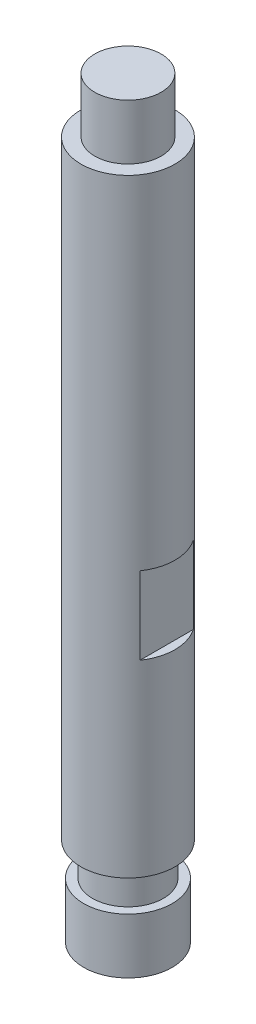
ISO-10303-21;
HEADER;
FILE_DESCRIPTION(('STEP AP214'),'2;1');
FILE_NAME('part.step','',(''),(''),'','','');
FILE_SCHEMA(('AUTOMOTIVE_DESIGN { 1 0 10303 214 1 1 1 1 }'));
ENDSEC;
DATA;
#1=APPLICATION_CONTEXT('core data for automotive mechanical design processes');
#2=APPLICATION_PROTOCOL_DEFINITION('international standard','automotive_design',2000,#1);
#3=PRODUCT_CONTEXT('',#1,'mechanical');
#4=PRODUCT('Part','Part','',(#3));
#5=PRODUCT_RELATED_PRODUCT_CATEGORY('part','',(#4));
#6=PRODUCT_DEFINITION_FORMATION('','',#4);
#7=PRODUCT_DEFINITION_CONTEXT('part definition',#1,'design');
#8=PRODUCT_DEFINITION('design','',#6,#7);
#9=PRODUCT_DEFINITION_SHAPE('','',#8);
#10=(LENGTH_UNIT() NAMED_UNIT(*) SI_UNIT(.MILLI.,.METRE.));
#11=(NAMED_UNIT(*) PLANE_ANGLE_UNIT() SI_UNIT($,.RADIAN.));
#12=(NAMED_UNIT(*) SI_UNIT($,.STERADIAN.) SOLID_ANGLE_UNIT());
#13=UNCERTAINTY_MEASURE_WITH_UNIT(LENGTH_MEASURE(1.E-05),#10,'distance_accuracy_value','');
#14=(GEOMETRIC_REPRESENTATION_CONTEXT(3) GLOBAL_UNCERTAINTY_ASSIGNED_CONTEXT((#13)) GLOBAL_UNIT_ASSIGNED_CONTEXT((#10,
#11,#12)) REPRESENTATION_CONTEXT('',''));
#15=CARTESIAN_POINT('',(0.,0.,0.));
#16=DIRECTION('',(0.,0.,1.));
#17=DIRECTION('',(1.,0.,0.));
#18=AXIS2_PLACEMENT_3D('',#15,#16,#17);
#19=CARTESIAN_POINT('',(0.,55.,0.));
#20=DIRECTION('',(0.,-1.,0.));
#21=DIRECTION('',(0.,0.,-1.));
#22=AXIS2_PLACEMENT_3D('',#19,#20,#21);
#23=CYLINDRICAL_SURFACE('',#22,4.25);
#24=CARTESIAN_POINT('',(0.,0.,0.));
#25=DIRECTION('',(0.,1.,0.));
#26=DIRECTION('',(0.,0.,1.));
#27=AXIS2_PLACEMENT_3D('',#24,#25,#26);
#28=CIRCLE('',#27,4.25);
#29=CARTESIAN_POINT('',(0.,0.,4.25));
#30=VERTEX_POINT('',#29);
#31=EDGE_CURVE('E132',#30,#30,#28,.T.);
#32=ORIENTED_EDGE('',*,*,#31,.T.);
#33=EDGE_LOOP('',(#32));
#34=FACE_BOUND('',#33,.T.);
#35=CARTESIAN_POINT('',(0.,55.,0.));
#36=DIRECTION('',(0.,1.,0.));
#37=DIRECTION('',(0.,0.,1.));
#38=AXIS2_PLACEMENT_3D('',#35,#36,#37);
#39=CIRCLE('',#38,4.25);
#40=CARTESIAN_POINT('',(0.,55.,4.25));
#41=VERTEX_POINT('',#40);
#42=EDGE_CURVE('E127',#41,#41,#39,.T.);
#43=ORIENTED_EDGE('',*,*,#42,.F.);
#44=EDGE_LOOP('',(#43));
#45=FACE_BOUND('',#44,.T.);
#46=CARTESIAN_POINT('',(0.,17.,0.));
#47=DIRECTION('',(0.,1.,0.));
#48=DIRECTION('',(0.,0.,1.));
#49=AXIS2_PLACEMENT_3D('',#46,#47,#48);
#50=CIRCLE('',#49,4.25);
#51=CARTESIAN_POINT('',(3.5,17.,2.41091269024824));
#52=VERTEX_POINT('',#51);
#53=CARTESIAN_POINT('',(3.5,17.,-2.41091269024824));
#54=VERTEX_POINT('',#53);
#55=EDGE_CURVE('E104',#52,#54,#50,.T.);
#56=ORIENTED_EDGE('',*,*,#55,.F.);
#57=DIRECTION('',(0.,-1.,0.));
#58=VECTOR('',#57,1.);
#59=CARTESIAN_POINT('',(3.5,55.,2.41091269024824));
#60=LINE('',#59,#58);
#61=CARTESIAN_POINT('',(3.5,24.,2.41091269024824));
#62=VERTEX_POINT('',#61);
#63=EDGE_CURVE('E98',#62,#52,#60,.T.);
#64=ORIENTED_EDGE('',*,*,#63,.F.);
#65=CARTESIAN_POINT('',(0.,24.,0.));
#66=DIRECTION('',(0.,-1.,0.));
#67=DIRECTION('',(0.,0.,-1.));
#68=AXIS2_PLACEMENT_3D('',#65,#66,#67);
#69=CIRCLE('',#68,4.25);
#70=CARTESIAN_POINT('',(3.5,24.,-2.41091269024824));
#71=VERTEX_POINT('',#70);
#72=EDGE_CURVE('E82',#71,#62,#69,.T.);
#73=ORIENTED_EDGE('',*,*,#72,.F.);
#74=DIRECTION('',(0.,-1.,0.));
#75=VECTOR('',#74,1.);
#76=CARTESIAN_POINT('',(3.5,55.,-2.41091269024824));
#77=LINE('',#76,#75);
#78=EDGE_CURVE('E91',#54,#71,#77,.F.);
#79=ORIENTED_EDGE('',*,*,#78,.F.);
#80=EDGE_LOOP('',(#56,#64,#73,#79));
#81=FACE_BOUND('',#80,.T.);
#82=CARTESIAN_POINT('',(0.,24.,0.));
#83=DIRECTION('',(0.,-1.,0.));
#84=DIRECTION('',(0.,0.,-1.));
#85=AXIS2_PLACEMENT_3D('',#82,#83,#84);
#86=CIRCLE('',#85,4.25);
#87=CARTESIAN_POINT('',(-3.5,24.,2.41091269024824));
#88=VERTEX_POINT('',#87);
#89=CARTESIAN_POINT('',(-3.5,24.,-2.41091269024824));
#90=VERTEX_POINT('',#89);
#91=EDGE_CURVE('E111',#88,#90,#86,.T.);
#92=ORIENTED_EDGE('',*,*,#91,.F.);
#93=DIRECTION('',(0.,-1.,0.));
#94=VECTOR('',#93,1.);
#95=CARTESIAN_POINT('',(-3.50000000000001,55.,2.41091269024823));
#96=LINE('',#95,#94);
#97=CARTESIAN_POINT('',(-3.5,17.,2.41091269024823));
#98=VERTEX_POINT('',#97);
#99=EDGE_CURVE('E11',#98,#88,#96,.F.);
#100=ORIENTED_EDGE('',*,*,#99,.F.);
#101=CARTESIAN_POINT('',(0.,17.,0.));
#102=DIRECTION('',(0.,1.,0.));
#103=DIRECTION('',(0.,0.,1.));
#104=AXIS2_PLACEMENT_3D('',#101,#102,#103);
#105=CIRCLE('',#104,4.25);
#106=CARTESIAN_POINT('',(-3.5,17.,-2.41091269024823));
#107=VERTEX_POINT('',#106);
#108=EDGE_CURVE('E51',#107,#98,#105,.T.);
#109=ORIENTED_EDGE('',*,*,#108,.F.);
#110=DIRECTION('',(0.,-1.,0.));
#111=VECTOR('',#110,1.);
#112=CARTESIAN_POINT('',(-3.50000000000001,55.,-2.41091269024823));
#113=LINE('',#112,#111);
#114=EDGE_CURVE('E117',#90,#107,#113,.T.);
#115=ORIENTED_EDGE('',*,*,#114,.F.);
#116=EDGE_LOOP('',(#92,#100,#109,#115));
#117=FACE_BOUND('',#116,.T.);
#118=ADVANCED_FACE('F43',(#34,#45,#81,#117),#23,.T.);
#119=CARTESIAN_POINT('',(0.,55.,0.));
#120=DIRECTION('',(0.,1.,0.));
#121=DIRECTION('',(0.,0.,1.));
#122=AXIS2_PLACEMENT_3D('',#119,#120,#121);
#123=PLANE('',#122);
#124=CARTESIAN_POINT('',(0.,55.,0.));
#125=DIRECTION('',(0.,1.,0.));
#126=DIRECTION('',(0.,0.,1.));
#127=AXIS2_PLACEMENT_3D('',#124,#125,#126);
#128=CIRCLE('',#127,3.);
#129=CARTESIAN_POINT('',(0.,55.,3.));
#130=VERTEX_POINT('',#129);
#131=EDGE_CURVE('E92',#130,#130,#128,.T.);
#132=ORIENTED_EDGE('',*,*,#131,.F.);
#133=EDGE_LOOP('',(#132));
#134=FACE_BOUND('',#133,.T.);
#135=ORIENTED_EDGE('',*,*,#42,.T.);
#136=EDGE_LOOP('',(#135));
#137=FACE_BOUND('',#136,.T.);
#138=ADVANCED_FACE('F188',(#134,#137),#123,.T.);
#139=CARTESIAN_POINT('',(0.,0.,0.));
#140=DIRECTION('',(0.,1.,0.));
#141=DIRECTION('',(0.,0.,1.));
#142=AXIS2_PLACEMENT_3D('',#139,#140,#141);
#143=PLANE('',#142);
#144=ORIENTED_EDGE('',*,*,#31,.F.);
#145=EDGE_LOOP('',(#144));
#146=FACE_BOUND('',#145,.T.);
#147=CARTESIAN_POINT('',(0.,0.,0.));
#148=DIRECTION('',(0.,1.,0.));
#149=DIRECTION('',(0.,0.,1.));
#150=AXIS2_PLACEMENT_3D('',#147,#148,#149);
#151=CIRCLE('',#150,3.2);
#152=CARTESIAN_POINT('',(0.,0.,3.2));
#153=VERTEX_POINT('',#152);
#154=EDGE_CURVE('E157',#153,#153,#151,.T.);
#155=ORIENTED_EDGE('',*,*,#154,.T.);
#156=EDGE_LOOP('',(#155));
#157=FACE_BOUND('',#156,.T.);
#158=ADVANCED_FACE('F193',(#146,#157),#143,.F.);
#159=CARTESIAN_POINT('',(0.,60.,0.));
#160=DIRECTION('',(0.,-1.,0.));
#161=DIRECTION('',(0.,0.,-1.));
#162=AXIS2_PLACEMENT_3D('',#159,#160,#161);
#163=CYLINDRICAL_SURFACE('',#162,3.);
#164=CARTESIAN_POINT('',(0.,60.,0.));
#165=DIRECTION('',(0.,1.,0.));
#166=DIRECTION('',(0.,0.,1.));
#167=AXIS2_PLACEMENT_3D('',#164,#165,#166);
#168=CIRCLE('',#167,3.);
#169=CARTESIAN_POINT('',(0.,60.,3.));
#170=VERTEX_POINT('',#169);
#171=EDGE_CURVE('E137',#170,#170,#168,.T.);
#172=ORIENTED_EDGE('',*,*,#171,.F.);
#173=EDGE_LOOP('',(#172));
#174=FACE_BOUND('',#173,.T.);
#175=ORIENTED_EDGE('',*,*,#131,.T.);
#176=EDGE_LOOP('',(#175));
#177=FACE_BOUND('',#176,.T.);
#178=ADVANCED_FACE('F202',(#174,#177),#163,.T.);
#179=CARTESIAN_POINT('',(0.,60.,0.));
#180=DIRECTION('',(0.,1.,0.));
#181=DIRECTION('',(0.,0.,1.));
#182=AXIS2_PLACEMENT_3D('',#179,#180,#181);
#183=PLANE('',#182);
#184=ORIENTED_EDGE('',*,*,#171,.T.);
#185=EDGE_LOOP('',(#184));
#186=FACE_BOUND('',#185,.T.);
#187=ADVANCED_FACE('F185',(#186),#183,.T.);
#188=CARTESIAN_POINT('',(3.5,24.,10.));
#189=DIRECTION('',(1.,0.,0.));
#190=DIRECTION('',(0.,1.,0.));
#191=AXIS2_PLACEMENT_3D('',#188,#189,#190);
#192=PLANE('',#191);
#193=ORIENTED_EDGE('',*,*,#63,.T.);
#194=DIRECTION('',(0.,0.,-1.));
#195=VECTOR('',#194,1.);
#196=CARTESIAN_POINT('',(3.5,17.,10.));
#197=LINE('',#196,#195);
#198=EDGE_CURVE('E101',#52,#54,#197,.T.);
#199=ORIENTED_EDGE('',*,*,#198,.T.);
#200=ORIENTED_EDGE('',*,*,#78,.T.);
#201=DIRECTION('',(0.,0.,-1.));
#202=VECTOR('',#201,1.);
#203=CARTESIAN_POINT('',(3.5,24.,10.));
#204=LINE('',#203,#202);
#205=EDGE_CURVE('E85',#62,#71,#204,.T.);
#206=ORIENTED_EDGE('',*,*,#205,.F.);
#207=EDGE_LOOP('',(#193,#199,#200,#206));
#208=FACE_BOUND('',#207,.T.);
#209=ADVANCED_FACE('F96',(#208),#192,.T.);
#210=CARTESIAN_POINT('',(3.5,17.,10.));
#211=DIRECTION('',(0.,1.,0.));
#212=DIRECTION('',(0.,0.,1.));
#213=AXIS2_PLACEMENT_3D('',#210,#211,#212);
#214=PLANE('',#213);
#215=ORIENTED_EDGE('',*,*,#198,.F.);
#216=ORIENTED_EDGE('',*,*,#55,.T.);
#217=EDGE_LOOP('',(#215,#216));
#218=FACE_BOUND('',#217,.T.);
#219=ADVANCED_FACE('F176',(#218),#214,.T.);
#220=CARTESIAN_POINT('',(3.5,24.,10.));
#221=DIRECTION('',(0.,-1.,0.));
#222=DIRECTION('',(0.,0.,-1.));
#223=AXIS2_PLACEMENT_3D('',#220,#221,#222);
#224=PLANE('',#223);
#225=ORIENTED_EDGE('',*,*,#205,.T.);
#226=ORIENTED_EDGE('',*,*,#72,.T.);
#227=EDGE_LOOP('',(#225,#226));
#228=FACE_BOUND('',#227,.T.);
#229=ADVANCED_FACE('F84',(#228),#224,.T.);
#230=CARTESIAN_POINT('',(-3.5,17.,10.));
#231=DIRECTION('',(0.,1.,0.));
#232=DIRECTION('',(0.,0.,1.));
#233=AXIS2_PLACEMENT_3D('',#230,#231,#232);
#234=PLANE('',#233);
#235=DIRECTION('',(0.,0.,-1.));
#236=VECTOR('',#235,1.);
#237=CARTESIAN_POINT('',(-3.5,17.,10.));
#238=LINE('',#237,#236);
#239=EDGE_CURVE('E142',#98,#107,#238,.T.);
#240=ORIENTED_EDGE('',*,*,#239,.T.);
#241=ORIENTED_EDGE('',*,*,#108,.T.);
#242=EDGE_LOOP('',(#240,#241));
#243=FACE_BOUND('',#242,.T.);
#244=ADVANCED_FACE('F183',(#243),#234,.T.);
#245=CARTESIAN_POINT('',(-3.5,24.,10.));
#246=DIRECTION('',(-1.,0.,0.));
#247=DIRECTION('',(0.,-1.,0.));
#248=AXIS2_PLACEMENT_3D('',#245,#246,#247);
#249=PLANE('',#248);
#250=ORIENTED_EDGE('',*,*,#114,.T.);
#251=ORIENTED_EDGE('',*,*,#239,.F.);
#252=ORIENTED_EDGE('',*,*,#99,.T.);
#253=DIRECTION('',(0.,0.,-1.));
#254=VECTOR('',#253,1.);
#255=CARTESIAN_POINT('',(-3.5,24.,10.));
#256=LINE('',#255,#254);
#257=EDGE_CURVE('E167',#88,#90,#256,.T.);
#258=ORIENTED_EDGE('',*,*,#257,.T.);
#259=EDGE_LOOP('',(#250,#251,#252,#258));
#260=FACE_BOUND('',#259,.T.);
#261=ADVANCED_FACE('F235',(#260),#249,.T.);
#262=CARTESIAN_POINT('',(-3.5,24.,10.));
#263=DIRECTION('',(0.,-1.,0.));
#264=DIRECTION('',(0.,0.,-1.));
#265=AXIS2_PLACEMENT_3D('',#262,#263,#264);
#266=PLANE('',#265);
#267=ORIENTED_EDGE('',*,*,#257,.F.);
#268=ORIENTED_EDGE('',*,*,#91,.T.);
#269=EDGE_LOOP('',(#267,#268));
#270=FACE_BOUND('',#269,.T.);
#271=ADVANCED_FACE('F239',(#270),#266,.T.);
#272=CARTESIAN_POINT('',(0.,-3.,-4.));
#273=DIRECTION('',(0.,1.,0.));
#274=DIRECTION('',(0.,0.,1.));
#275=AXIS2_PLACEMENT_3D('',#272,#273,#274);
#276=PLANE('',#275);
#277=CARTESIAN_POINT('',(0.,-3.,0.));
#278=DIRECTION('',(0.,1.,0.));
#279=DIRECTION('',(0.,0.,1.));
#280=AXIS2_PLACEMENT_3D('',#277,#278,#279);
#281=CIRCLE('',#280,4.);
#282=CARTESIAN_POINT('',(0.,-3.,4.));
#283=VERTEX_POINT('',#282);
#284=EDGE_CURVE('E147',#283,#283,#281,.T.);
#285=ORIENTED_EDGE('',*,*,#284,.T.);
#286=EDGE_LOOP('',(#285));
#287=FACE_BOUND('',#286,.T.);
#288=CARTESIAN_POINT('',(0.,-3.,0.));
#289=DIRECTION('',(0.,1.,0.));
#290=DIRECTION('',(0.,0.,1.));
#291=AXIS2_PLACEMENT_3D('',#288,#289,#290);
#292=CIRCLE('',#291,3.2);
#293=CARTESIAN_POINT('',(0.,-3.,3.2));
#294=VERTEX_POINT('',#293);
#295=EDGE_CURVE('E152',#294,#294,#292,.T.);
#296=ORIENTED_EDGE('',*,*,#295,.F.);
#297=EDGE_LOOP('',(#296));
#298=FACE_BOUND('',#297,.T.);
#299=ADVANCED_FACE('F254',(#287,#298),#276,.T.);
#300=CARTESIAN_POINT('',(0.,55.,0.));
#301=DIRECTION('',(0.,1.,0.));
#302=DIRECTION('',(0.,0.,1.));
#303=AXIS2_PLACEMENT_3D('',#300,#301,#302);
#304=CYLINDRICAL_SURFACE('',#303,3.2);
#305=ORIENTED_EDGE('',*,*,#295,.T.);
#306=EDGE_LOOP('',(#305));
#307=FACE_BOUND('',#306,.T.);
#308=ORIENTED_EDGE('',*,*,#154,.F.);
#309=EDGE_LOOP('',(#308));
#310=FACE_BOUND('',#309,.T.);
#311=ADVANCED_FACE('F261',(#307,#310),#304,.T.);
#312=CARTESIAN_POINT('',(0.,-8.,0.));
#313=DIRECTION('',(0.,1.,0.));
#314=DIRECTION('',(0.,0.,1.));
#315=AXIS2_PLACEMENT_3D('',#312,#313,#314);
#316=PLANE('',#315);
#317=CARTESIAN_POINT('',(0.,-8.,0.));
#318=DIRECTION('',(0.,1.,0.));
#319=DIRECTION('',(0.,0.,1.));
#320=AXIS2_PLACEMENT_3D('',#317,#318,#319);
#321=CIRCLE('',#320,4.);
#322=CARTESIAN_POINT('',(0.,-8.,4.));
#323=VERTEX_POINT('',#322);
#324=EDGE_CURVE('E102',#323,#323,#321,.T.);
#325=ORIENTED_EDGE('',*,*,#324,.F.);
#326=EDGE_LOOP('',(#325));
#327=FACE_BOUND('',#326,.T.);
#328=ADVANCED_FACE('F269',(#327),#316,.F.);
#329=CARTESIAN_POINT('',(0.,-8.,0.));
#330=DIRECTION('',(0.,1.,0.));
#331=DIRECTION('',(0.,0.,1.));
#332=AXIS2_PLACEMENT_3D('',#329,#330,#331);
#333=CYLINDRICAL_SURFACE('',#332,4.);
#334=ORIENTED_EDGE('',*,*,#324,.T.);
#335=EDGE_LOOP('',(#334));
#336=FACE_BOUND('',#335,.T.);
#337=ORIENTED_EDGE('',*,*,#284,.F.);
#338=EDGE_LOOP('',(#337));
#339=FACE_BOUND('',#338,.T.);
#340=ADVANCED_FACE('F230',(#336,#339),#333,.T.);
#341=CLOSED_SHELL('',(#118,#138,#158,#178,#187,#209,#219,#229,#244,#261,#271,#299,#311,#328,#340));
#342=MANIFOLD_SOLID_BREP('B2',#341);
#343=ADVANCED_BREP_SHAPE_REPRESENTATION('',(#18,#342),#14);
#344=SHAPE_DEFINITION_REPRESENTATION(#9,#343);
ENDSEC;
END-ISO-10303-21;
